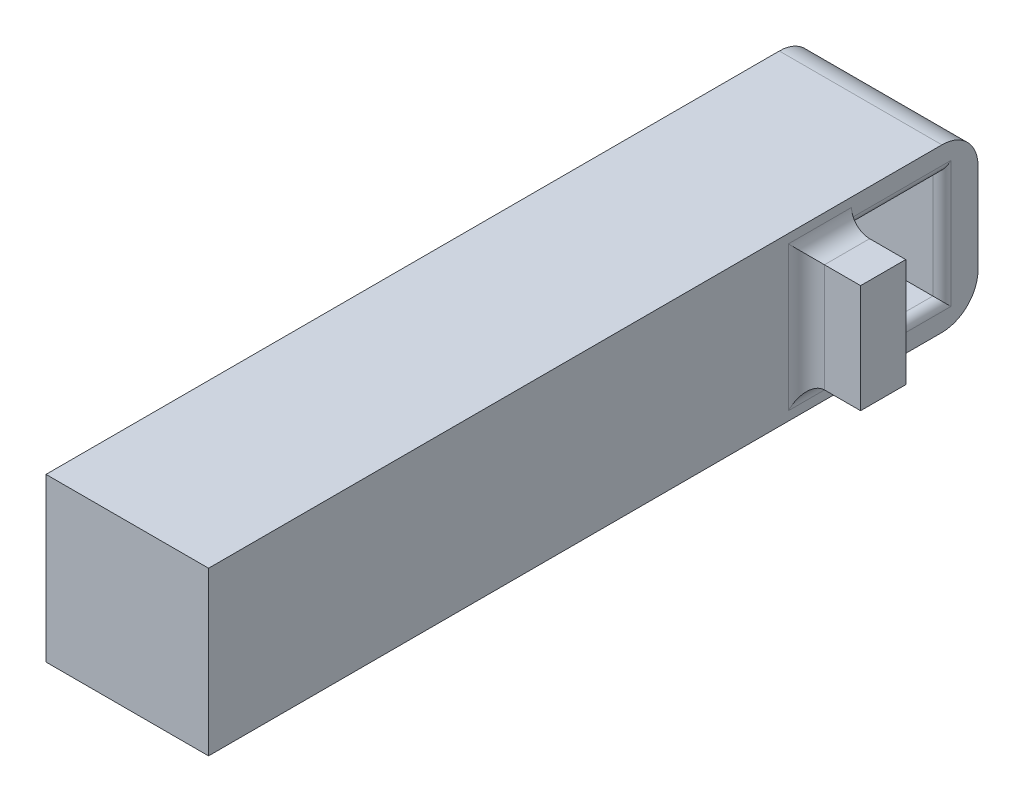
ISO-10303-21;
HEADER;
FILE_DESCRIPTION(('STEP AP214'),'2;1');
FILE_NAME('part.step','',(''),(''),'','','');
FILE_SCHEMA(('AUTOMOTIVE_DESIGN { 1 0 10303 214 1 1 1 1 }'));
ENDSEC;
DATA;
#1=APPLICATION_CONTEXT('core data for automotive mechanical design processes');
#2=APPLICATION_PROTOCOL_DEFINITION('international standard','automotive_design',2000,#1);
#3=PRODUCT_CONTEXT('',#1,'mechanical');
#4=PRODUCT('Part','Part','',(#3));
#5=PRODUCT_RELATED_PRODUCT_CATEGORY('part','',(#4));
#6=PRODUCT_DEFINITION_FORMATION('','',#4);
#7=PRODUCT_DEFINITION_CONTEXT('part definition',#1,'design');
#8=PRODUCT_DEFINITION('design','',#6,#7);
#9=PRODUCT_DEFINITION_SHAPE('','',#8);
#10=(LENGTH_UNIT() NAMED_UNIT(*) SI_UNIT(.MILLI.,.METRE.));
#11=(NAMED_UNIT(*) PLANE_ANGLE_UNIT() SI_UNIT($,.RADIAN.));
#12=(NAMED_UNIT(*) SI_UNIT($,.STERADIAN.) SOLID_ANGLE_UNIT());
#13=UNCERTAINTY_MEASURE_WITH_UNIT(LENGTH_MEASURE(1.E-05),#10,'distance_accuracy_value','');
#14=(GEOMETRIC_REPRESENTATION_CONTEXT(3) GLOBAL_UNCERTAINTY_ASSIGNED_CONTEXT((#13)) GLOBAL_UNIT_ASSIGNED_CONTEXT((#10,
#11,#12)) REPRESENTATION_CONTEXT('',''));
#15=CARTESIAN_POINT('',(0.,0.,0.));
#16=DIRECTION('',(0.,0.,1.));
#17=DIRECTION('',(1.,0.,0.));
#18=AXIS2_PLACEMENT_3D('',#15,#16,#17);
#19=CARTESIAN_POINT('',(9.,0.,0.));
#20=DIRECTION('',(-1.,0.,0.));
#21=DIRECTION('',(0.,0.,1.));
#22=AXIS2_PLACEMENT_3D('',#19,#20,#21);
#23=PLANE('',#22);
#24=DIRECTION('',(0.,0.,-1.));
#25=VECTOR('',#24,1.);
#26=CARTESIAN_POINT('',(9.,0.,0.));
#27=LINE('',#26,#25);
#28=CARTESIAN_POINT('',(9.,0.,0.));
#29=VERTEX_POINT('',#28);
#30=CARTESIAN_POINT('',(9.,0.,-81.1999999999999));
#31=VERTEX_POINT('',#30);
#32=EDGE_CURVE('E225',#29,#31,#27,.T.);
#33=ORIENTED_EDGE('',*,*,#32,.T.);
#34=CARTESIAN_POINT('',(9.,4.,-81.2));
#35=DIRECTION('',(-1.,0.,0.));
#36=DIRECTION('',(0.,0.,1.));
#37=AXIS2_PLACEMENT_3D('',#34,#35,#36);
#38=CIRCLE('',#37,4.);
#39=CARTESIAN_POINT('',(9.,4.,-85.2));
#40=VERTEX_POINT('',#39);
#41=EDGE_CURVE('E51',#31,#40,#38,.F.);
#42=ORIENTED_EDGE('',*,*,#41,.T.);
#43=DIRECTION('',(0.,1.,0.));
#44=VECTOR('',#43,1.);
#45=CARTESIAN_POINT('',(9.,0.,-85.2));
#46=LINE('',#45,#44);
#47=CARTESIAN_POINT('',(9.,14.,-85.2));
#48=VERTEX_POINT('',#47);
#49=EDGE_CURVE('E228',#40,#48,#46,.T.);
#50=ORIENTED_EDGE('',*,*,#49,.T.);
#51=CARTESIAN_POINT('',(9.,14.,-81.2));
#52=DIRECTION('',(-1.,0.,0.));
#53=DIRECTION('',(0.,0.,1.));
#54=AXIS2_PLACEMENT_3D('',#51,#52,#53);
#55=CIRCLE('',#54,4.);
#56=CARTESIAN_POINT('',(9.,18.,-81.1999999999999));
#57=VERTEX_POINT('',#56);
#58=EDGE_CURVE('E58',#48,#57,#55,.F.);
#59=ORIENTED_EDGE('',*,*,#58,.T.);
#60=DIRECTION('',(0.,0.,1.));
#61=VECTOR('',#60,1.);
#62=CARTESIAN_POINT('',(9.,18.,0.));
#63=LINE('',#62,#61);
#64=CARTESIAN_POINT('',(9.,18.,0.));
#65=VERTEX_POINT('',#64);
#66=EDGE_CURVE('E230',#57,#65,#63,.T.);
#67=ORIENTED_EDGE('',*,*,#66,.T.);
#68=DIRECTION('',(0.,-1.,0.));
#69=VECTOR('',#68,1.);
#70=CARTESIAN_POINT('',(9.,0.,0.));
#71=LINE('',#70,#69);
#72=EDGE_CURVE('E222',#65,#29,#71,.T.);
#73=ORIENTED_EDGE('',*,*,#72,.T.);
#74=EDGE_LOOP('',(#33,#42,#50,#59,#67,#73));
#75=FACE_BOUND('',#74,.T.);
#76=DIRECTION('',(0.,1.,0.));
#77=VECTOR('',#76,1.);
#78=CARTESIAN_POINT('',(9.,3.,-82.2));
#79=LINE('',#78,#77);
#80=CARTESIAN_POINT('',(9.,16.,-82.2));
#81=VERTEX_POINT('',#80);
#82=CARTESIAN_POINT('',(9.,2.,-82.2));
#83=VERTEX_POINT('',#82);
#84=EDGE_CURVE('E279',#81,#83,#79,.F.);
#85=ORIENTED_EDGE('',*,*,#84,.T.);
#86=DIRECTION('',(0.,0.,-1.));
#87=VECTOR('',#86,1.);
#88=CARTESIAN_POINT('',(9.,2.,-71.2));
#89=LINE('',#88,#87);
#90=CARTESIAN_POINT('',(9.,2.,-71.2));
#91=VERTEX_POINT('',#90);
#92=EDGE_CURVE('E281',#83,#91,#89,.F.);
#93=ORIENTED_EDGE('',*,*,#92,.T.);
#94=DIRECTION('',(0.,-1.,0.));
#95=VECTOR('',#94,1.);
#96=CARTESIAN_POINT('',(9.,0.,-71.2));
#97=LINE('',#96,#95);
#98=CARTESIAN_POINT('',(9.,1.,-71.2));
#99=VERTEX_POINT('',#98);
#100=EDGE_CURVE('E251',#91,#99,#97,.T.);
#101=ORIENTED_EDGE('',*,*,#100,.T.);
#102=DIRECTION('',(0.,0.,-1.));
#103=VECTOR('',#102,1.);
#104=CARTESIAN_POINT('',(9.,1.,-66.2));
#105=LINE('',#104,#103);
#106=CARTESIAN_POINT('',(9.,0.999999999999999,-64.2));
#107=VERTEX_POINT('',#106);
#108=EDGE_CURVE('E249',#99,#107,#105,.F.);
#109=ORIENTED_EDGE('',*,*,#108,.T.);
#110=DIRECTION('',(0.,-1.,0.));
#111=VECTOR('',#110,1.);
#112=CARTESIAN_POINT('',(9.,15.,-64.2));
#113=LINE('',#112,#111);
#114=CARTESIAN_POINT('',(9.,17.,-64.2));
#115=VERTEX_POINT('',#114);
#116=EDGE_CURVE('E253',#107,#115,#113,.F.);
#117=ORIENTED_EDGE('',*,*,#116,.T.);
#118=DIRECTION('',(0.,0.,1.));
#119=VECTOR('',#118,1.);
#120=CARTESIAN_POINT('',(9.,17.,-71.2));
#121=LINE('',#120,#119);
#122=CARTESIAN_POINT('',(9.,17.,-71.2));
#123=VERTEX_POINT('',#122);
#124=EDGE_CURVE('E255',#115,#123,#121,.F.);
#125=ORIENTED_EDGE('',*,*,#124,.T.);
#126=DIRECTION('',(0.,-1.,0.));
#127=VECTOR('',#126,1.);
#128=CARTESIAN_POINT('',(9.,0.,-71.2));
#129=LINE('',#128,#127);
#130=CARTESIAN_POINT('',(9.,16.,-71.2));
#131=VERTEX_POINT('',#130);
#132=EDGE_CURVE('E258',#123,#131,#129,.T.);
#133=ORIENTED_EDGE('',*,*,#132,.T.);
#134=DIRECTION('',(0.,0.,1.));
#135=VECTOR('',#134,1.);
#136=CARTESIAN_POINT('',(9.,16.,-81.2));
#137=LINE('',#136,#135);
#138=EDGE_CURVE('E277',#131,#81,#137,.F.);
#139=ORIENTED_EDGE('',*,*,#138,.T.);
#140=EDGE_LOOP('',(#85,#93,#101,#109,#117,#125,#133,#139));
#141=FACE_BOUND('',#140,.T.);
#142=ADVANCED_FACE('F43',(#75,#141),#23,.F.);
#143=CARTESIAN_POINT('',(-9.,0.,0.));
#144=DIRECTION('',(-1.,0.,0.));
#145=DIRECTION('',(0.,0.,1.));
#146=AXIS2_PLACEMENT_3D('',#143,#144,#145);
#147=PLANE('',#146);
#148=DIRECTION('',(0.,1.,0.));
#149=VECTOR('',#148,1.);
#150=CARTESIAN_POINT('',(-9.,0.,-85.2));
#151=LINE('',#150,#149);
#152=CARTESIAN_POINT('',(-9.,4.,-85.2));
#153=VERTEX_POINT('',#152);
#154=CARTESIAN_POINT('',(-9.,14.,-85.2));
#155=VERTEX_POINT('',#154);
#156=EDGE_CURVE('E237',#153,#155,#151,.T.);
#157=ORIENTED_EDGE('',*,*,#156,.F.);
#158=CARTESIAN_POINT('',(-9.,4.,-81.2));
#159=DIRECTION('',(-1.,0.,0.));
#160=DIRECTION('',(0.,0.,1.));
#161=AXIS2_PLACEMENT_3D('',#158,#159,#160);
#162=CIRCLE('',#161,4.);
#163=CARTESIAN_POINT('',(-9.,0.,-81.1999999999999));
#164=VERTEX_POINT('',#163);
#165=EDGE_CURVE('E302',#153,#164,#162,.T.);
#166=ORIENTED_EDGE('',*,*,#165,.T.);
#167=DIRECTION('',(0.,0.,-1.));
#168=VECTOR('',#167,1.);
#169=CARTESIAN_POINT('',(-9.,0.,0.));
#170=LINE('',#169,#168);
#171=CARTESIAN_POINT('',(-9.,0.,0.));
#172=VERTEX_POINT('',#171);
#173=EDGE_CURVE('E235',#172,#164,#170,.T.);
#174=ORIENTED_EDGE('',*,*,#173,.F.);
#175=DIRECTION('',(0.,-1.,0.));
#176=VECTOR('',#175,1.);
#177=CARTESIAN_POINT('',(-9.,0.,0.));
#178=LINE('',#177,#176);
#179=CARTESIAN_POINT('',(-9.,18.,0.));
#180=VERTEX_POINT('',#179);
#181=EDGE_CURVE('E221',#180,#172,#178,.T.);
#182=ORIENTED_EDGE('',*,*,#181,.F.);
#183=DIRECTION('',(0.,0.,1.));
#184=VECTOR('',#183,1.);
#185=CARTESIAN_POINT('',(-9.,18.,0.));
#186=LINE('',#185,#184);
#187=CARTESIAN_POINT('',(-9.,18.,-81.1999999999999));
#188=VERTEX_POINT('',#187);
#189=EDGE_CURVE('E226',#188,#180,#186,.T.);
#190=ORIENTED_EDGE('',*,*,#189,.F.);
#191=CARTESIAN_POINT('',(-9.,14.,-81.2));
#192=DIRECTION('',(-1.,0.,0.));
#193=DIRECTION('',(0.,0.,1.));
#194=AXIS2_PLACEMENT_3D('',#191,#192,#193);
#195=CIRCLE('',#194,4.);
#196=EDGE_CURVE('E300',#188,#155,#195,.T.);
#197=ORIENTED_EDGE('',*,*,#196,.T.);
#198=EDGE_LOOP('',(#157,#166,#174,#182,#190,#197));
#199=FACE_BOUND('',#198,.T.);
#200=DIRECTION('',(0.,0.,-1.));
#201=VECTOR('',#200,1.);
#202=CARTESIAN_POINT('',(-9.,3.,-81.2));
#203=LINE('',#202,#201);
#204=CARTESIAN_POINT('',(-9.,3.,-71.2));
#205=VERTEX_POINT('',#204);
#206=CARTESIAN_POINT('',(-9.,3.,-81.2));
#207=VERTEX_POINT('',#206);
#208=EDGE_CURVE('E210',#205,#207,#203,.T.);
#209=ORIENTED_EDGE('',*,*,#208,.T.);
#210=DIRECTION('',(0.,1.,0.));
#211=VECTOR('',#210,1.);
#212=CARTESIAN_POINT('',(-9.,3.,-81.2));
#213=LINE('',#212,#211);
#214=CARTESIAN_POINT('',(-9.,15.,-81.2));
#215=VERTEX_POINT('',#214);
#216=EDGE_CURVE('E196',#207,#215,#213,.T.);
#217=ORIENTED_EDGE('',*,*,#216,.T.);
#218=DIRECTION('',(0.,0.,1.));
#219=VECTOR('',#218,1.);
#220=CARTESIAN_POINT('',(-9.,15.,-81.2));
#221=LINE('',#220,#219);
#222=CARTESIAN_POINT('',(-9.,15.,-71.2));
#223=VERTEX_POINT('',#222);
#224=EDGE_CURVE('E199',#215,#223,#221,.T.);
#225=ORIENTED_EDGE('',*,*,#224,.T.);
#226=DIRECTION('',(0.,-1.,0.));
#227=VECTOR('',#226,1.);
#228=CARTESIAN_POINT('',(-9.,3.,-71.2));
#229=LINE('',#228,#227);
#230=EDGE_CURVE('E207',#223,#205,#229,.T.);
#231=ORIENTED_EDGE('',*,*,#230,.T.);
#232=EDGE_LOOP('',(#209,#217,#225,#231));
#233=FACE_BOUND('',#232,.T.);
#234=ADVANCED_FACE('F316',(#199,#233),#147,.T.);
#235=CARTESIAN_POINT('',(9.,0.,0.));
#236=DIRECTION('',(0.,0.,-1.));
#237=DIRECTION('',(-1.,0.,0.));
#238=AXIS2_PLACEMENT_3D('',#235,#236,#237);
#239=PLANE('',#238);
#240=ORIENTED_EDGE('',*,*,#181,.T.);
#241=DIRECTION('',(-1.,0.,0.));
#242=VECTOR('',#241,1.);
#243=CARTESIAN_POINT('',(9.,0.,0.));
#244=LINE('',#243,#242);
#245=EDGE_CURVE('E243',#29,#172,#244,.T.);
#246=ORIENTED_EDGE('',*,*,#245,.F.);
#247=ORIENTED_EDGE('',*,*,#72,.F.);
#248=DIRECTION('',(-1.,0.,0.));
#249=VECTOR('',#248,1.);
#250=CARTESIAN_POINT('',(9.,18.,0.));
#251=LINE('',#250,#249);
#252=EDGE_CURVE('E232',#65,#180,#251,.T.);
#253=ORIENTED_EDGE('',*,*,#252,.T.);
#254=EDGE_LOOP('',(#240,#246,#247,#253));
#255=FACE_BOUND('',#254,.T.);
#256=ADVANCED_FACE('F323',(#255),#239,.F.);
#257=CARTESIAN_POINT('',(9.,0.,0.));
#258=DIRECTION('',(0.,1.,0.));
#259=DIRECTION('',(0.,0.,1.));
#260=AXIS2_PLACEMENT_3D('',#257,#258,#259);
#261=PLANE('',#260);
#262=ORIENTED_EDGE('',*,*,#173,.T.);
#263=DIRECTION('',(-1.,0.,0.));
#264=VECTOR('',#263,1.);
#265=CARTESIAN_POINT('',(9.,0.,-81.2));
#266=LINE('',#265,#264);
#267=EDGE_CURVE('E66',#164,#31,#266,.F.);
#268=ORIENTED_EDGE('',*,*,#267,.T.);
#269=ORIENTED_EDGE('',*,*,#32,.F.);
#270=ORIENTED_EDGE('',*,*,#245,.T.);
#271=EDGE_LOOP('',(#262,#268,#269,#270));
#272=FACE_BOUND('',#271,.T.);
#273=ADVANCED_FACE('F319',(#272),#261,.F.);
#274=CARTESIAN_POINT('',(9.,0.,-85.2));
#275=DIRECTION('',(0.,0.,1.));
#276=DIRECTION('',(1.,0.,0.));
#277=AXIS2_PLACEMENT_3D('',#274,#275,#276);
#278=PLANE('',#277);
#279=ORIENTED_EDGE('',*,*,#49,.F.);
#280=DIRECTION('',(-1.,0.,0.));
#281=VECTOR('',#280,1.);
#282=CARTESIAN_POINT('',(9.,4.,-85.2));
#283=LINE('',#282,#281);
#284=EDGE_CURVE('E297',#40,#153,#283,.T.);
#285=ORIENTED_EDGE('',*,*,#284,.T.);
#286=ORIENTED_EDGE('',*,*,#156,.T.);
#287=DIRECTION('',(-1.,0.,0.));
#288=VECTOR('',#287,1.);
#289=CARTESIAN_POINT('',(9.,14.,-85.2));
#290=LINE('',#289,#288);
#291=EDGE_CURVE('E291',#155,#48,#290,.F.);
#292=ORIENTED_EDGE('',*,*,#291,.T.);
#293=EDGE_LOOP('',(#279,#285,#286,#292));
#294=FACE_BOUND('',#293,.T.);
#295=ADVANCED_FACE('F311',(#294),#278,.F.);
#296=CARTESIAN_POINT('',(9.,18.,0.));
#297=DIRECTION('',(0.,-1.,0.));
#298=DIRECTION('',(0.,0.,-1.));
#299=AXIS2_PLACEMENT_3D('',#296,#297,#298);
#300=PLANE('',#299);
#301=ORIENTED_EDGE('',*,*,#66,.F.);
#302=DIRECTION('',(-1.,0.,0.));
#303=VECTOR('',#302,1.);
#304=CARTESIAN_POINT('',(9.,18.,-81.2));
#305=LINE('',#304,#303);
#306=EDGE_CURVE('E11',#57,#188,#305,.T.);
#307=ORIENTED_EDGE('',*,*,#306,.T.);
#308=ORIENTED_EDGE('',*,*,#189,.T.);
#309=ORIENTED_EDGE('',*,*,#252,.F.);
#310=EDGE_LOOP('',(#301,#307,#308,#309));
#311=FACE_BOUND('',#310,.T.);
#312=ADVANCED_FACE('F327',(#311),#300,.F.);
#313=CARTESIAN_POINT('',(9.,3.,-81.2));
#314=DIRECTION('',(0.,0.,1.));
#315=DIRECTION('',(1.,0.,0.));
#316=AXIS2_PLACEMENT_3D('',#313,#314,#315);
#317=PLANE('',#316);
#318=DIRECTION('',(-1.,0.,0.));
#319=VECTOR('',#318,1.);
#320=CARTESIAN_POINT('',(9.,3.,-81.2));
#321=LINE('',#320,#319);
#322=CARTESIAN_POINT('',(8.,3.,-81.2));
#323=VERTEX_POINT('',#322);
#324=EDGE_CURVE('E213',#323,#207,#321,.T.);
#325=ORIENTED_EDGE('',*,*,#324,.F.);
#326=DIRECTION('',(0.,1.,0.));
#327=VECTOR('',#326,1.);
#328=CARTESIAN_POINT('',(8.,15.,-81.2));
#329=LINE('',#328,#327);
#330=CARTESIAN_POINT('',(8.,15.,-81.2));
#331=VERTEX_POINT('',#330);
#332=EDGE_CURVE('E283',#323,#331,#329,.T.);
#333=ORIENTED_EDGE('',*,*,#332,.T.);
#334=DIRECTION('',(-1.,0.,0.));
#335=VECTOR('',#334,1.);
#336=CARTESIAN_POINT('',(9.,15.,-81.2));
#337=LINE('',#336,#335);
#338=EDGE_CURVE('E219',#331,#215,#337,.T.);
#339=ORIENTED_EDGE('',*,*,#338,.T.);
#340=ORIENTED_EDGE('',*,*,#216,.F.);
#341=EDGE_LOOP('',(#325,#333,#339,#340));
#342=FACE_BOUND('',#341,.T.);
#343=ADVANCED_FACE('F343',(#342),#317,.T.);
#344=CARTESIAN_POINT('',(9.,15.,-81.2));
#345=DIRECTION('',(0.,-1.,0.));
#346=DIRECTION('',(0.,0.,-1.));
#347=AXIS2_PLACEMENT_3D('',#344,#345,#346);
#348=PLANE('',#347);
#349=ORIENTED_EDGE('',*,*,#338,.F.);
#350=DIRECTION('',(0.,0.,1.));
#351=VECTOR('',#350,1.);
#352=CARTESIAN_POINT('',(8.,15.,-71.2));
#353=LINE('',#352,#351);
#354=CARTESIAN_POINT('',(8.,15.,-71.2));
#355=VERTEX_POINT('',#354);
#356=EDGE_CURVE('E285',#331,#355,#353,.T.);
#357=ORIENTED_EDGE('',*,*,#356,.T.);
#358=DIRECTION('',(-1.,0.,0.));
#359=VECTOR('',#358,1.);
#360=CARTESIAN_POINT('',(9.,15.,-71.2));
#361=LINE('',#360,#359);
#362=EDGE_CURVE('E217',#355,#223,#361,.T.);
#363=ORIENTED_EDGE('',*,*,#362,.T.);
#364=ORIENTED_EDGE('',*,*,#224,.F.);
#365=EDGE_LOOP('',(#349,#357,#363,#364));
#366=FACE_BOUND('',#365,.T.);
#367=ADVANCED_FACE('F417',(#366),#348,.T.);
#368=CARTESIAN_POINT('',(9.,3.,-71.2));
#369=DIRECTION('',(0.,0.,-1.));
#370=DIRECTION('',(-1.,0.,0.));
#371=AXIS2_PLACEMENT_3D('',#368,#369,#370);
#372=PLANE('',#371);
#373=ORIENTED_EDGE('',*,*,#230,.F.);
#374=ORIENTED_EDGE('',*,*,#362,.F.);
#375=CARTESIAN_POINT('',(8.,16.,-71.2));
#376=DIRECTION('',(0.,0.,-1.));
#377=DIRECTION('',(-1.,0.,0.));
#378=AXIS2_PLACEMENT_3D('',#375,#376,#377);
#379=CIRCLE('',#378,1.);
#380=EDGE_CURVE('E289',#355,#131,#379,.F.);
#381=ORIENTED_EDGE('',*,*,#380,.T.);
#382=ORIENTED_EDGE('',*,*,#132,.F.);
#383=CARTESIAN_POINT('',(11.,17.,-71.2));
#384=DIRECTION('',(0.,0.,-1.));
#385=DIRECTION('',(-1.,0.,0.));
#386=AXIS2_PLACEMENT_3D('',#383,#384,#385);
#387=CIRCLE('',#386,2.);
#388=CARTESIAN_POINT('',(11.,15.,-71.2));
#389=VERTEX_POINT('',#388);
#390=EDGE_CURVE('E195',#123,#389,#387,.F.);
#391=ORIENTED_EDGE('',*,*,#390,.T.);
#392=DIRECTION('',(-1.,0.,0.));
#393=VECTOR('',#392,1.);
#394=CARTESIAN_POINT('',(15.,15.,-71.2));
#395=LINE('',#394,#393);
#396=CARTESIAN_POINT('',(15.,15.,-71.2));
#397=VERTEX_POINT('',#396);
#398=EDGE_CURVE('E174',#397,#389,#395,.T.);
#399=ORIENTED_EDGE('',*,*,#398,.F.);
#400=DIRECTION('',(0.,1.,0.));
#401=VECTOR('',#400,1.);
#402=CARTESIAN_POINT('',(15.,3.,-71.2));
#403=LINE('',#402,#401);
#404=CARTESIAN_POINT('',(15.,3.,-71.2));
#405=VERTEX_POINT('',#404);
#406=EDGE_CURVE('E181',#405,#397,#403,.T.);
#407=ORIENTED_EDGE('',*,*,#406,.F.);
#408=DIRECTION('',(-1.,0.,0.));
#409=VECTOR('',#408,1.);
#410=CARTESIAN_POINT('',(15.,3.,-71.2));
#411=LINE('',#410,#409);
#412=CARTESIAN_POINT('',(11.,3.,-71.2));
#413=VERTEX_POINT('',#412);
#414=EDGE_CURVE('E392',#405,#413,#411,.T.);
#415=ORIENTED_EDGE('',*,*,#414,.T.);
#416=CARTESIAN_POINT('',(11.,1.,-71.2));
#417=DIRECTION('',(0.,0.,-1.));
#418=DIRECTION('',(-1.,0.,0.));
#419=AXIS2_PLACEMENT_3D('',#416,#417,#418);
#420=CIRCLE('',#419,2.);
#421=EDGE_CURVE('E266',#413,#99,#420,.F.);
#422=ORIENTED_EDGE('',*,*,#421,.T.);
#423=ORIENTED_EDGE('',*,*,#100,.F.);
#424=CARTESIAN_POINT('',(8.,2.,-71.2));
#425=DIRECTION('',(0.,0.,-1.));
#426=DIRECTION('',(-1.,0.,0.));
#427=AXIS2_PLACEMENT_3D('',#424,#425,#426);
#428=CIRCLE('',#427,1.);
#429=CARTESIAN_POINT('',(8.,3.,-71.2));
#430=VERTEX_POINT('',#429);
#431=EDGE_CURVE('E287',#91,#430,#428,.F.);
#432=ORIENTED_EDGE('',*,*,#431,.T.);
#433=DIRECTION('',(-1.,0.,0.));
#434=VECTOR('',#433,1.);
#435=CARTESIAN_POINT('',(9.,3.,-71.2));
#436=LINE('',#435,#434);
#437=EDGE_CURVE('E215',#430,#205,#436,.T.);
#438=ORIENTED_EDGE('',*,*,#437,.T.);
#439=EDGE_LOOP('',(#373,#374,#381,#382,#391,#399,#407,#415,#422,#423,#432,#438));
#440=FACE_BOUND('',#439,.T.);
#441=ADVANCED_FACE('F193',(#440),#372,.T.);
#442=CARTESIAN_POINT('',(9.,3.,-81.2));
#443=DIRECTION('',(0.,1.,0.));
#444=DIRECTION('',(0.,0.,1.));
#445=AXIS2_PLACEMENT_3D('',#442,#443,#444);
#446=PLANE('',#445);
#447=ORIENTED_EDGE('',*,*,#437,.F.);
#448=DIRECTION('',(0.,0.,-1.));
#449=VECTOR('',#448,1.);
#450=CARTESIAN_POINT('',(8.,3.,-81.2));
#451=LINE('',#450,#449);
#452=EDGE_CURVE('E269',#430,#323,#451,.T.);
#453=ORIENTED_EDGE('',*,*,#452,.T.);
#454=ORIENTED_EDGE('',*,*,#324,.T.);
#455=ORIENTED_EDGE('',*,*,#208,.F.);
#456=EDGE_LOOP('',(#447,#453,#454,#455));
#457=FACE_BOUND('',#456,.T.);
#458=ADVANCED_FACE('F410',(#457),#446,.T.);
#459=CARTESIAN_POINT('',(15.,15.,-71.2));
#460=DIRECTION('',(0.,-1.,0.));
#461=DIRECTION('',(0.,0.,-1.));
#462=AXIS2_PLACEMENT_3D('',#459,#460,#461);
#463=PLANE('',#462);
#464=ORIENTED_EDGE('',*,*,#398,.T.);
#465=DIRECTION('',(0.,0.,1.));
#466=VECTOR('',#465,1.);
#467=CARTESIAN_POINT('',(11.,15.,-66.2));
#468=LINE('',#467,#466);
#469=CARTESIAN_POINT('',(11.,15.,-66.2));
#470=VERTEX_POINT('',#469);
#471=EDGE_CURVE('E261',#389,#470,#468,.T.);
#472=ORIENTED_EDGE('',*,*,#471,.T.);
#473=DIRECTION('',(-1.,0.,0.));
#474=VECTOR('',#473,1.);
#475=CARTESIAN_POINT('',(15.,15.,-66.2));
#476=LINE('',#475,#474);
#477=CARTESIAN_POINT('',(15.,15.,-66.2));
#478=VERTEX_POINT('',#477);
#479=EDGE_CURVE('E177',#478,#470,#476,.T.);
#480=ORIENTED_EDGE('',*,*,#479,.F.);
#481=DIRECTION('',(0.,0.,1.));
#482=VECTOR('',#481,1.);
#483=CARTESIAN_POINT('',(15.,15.,-71.2));
#484=LINE('',#483,#482);
#485=EDGE_CURVE('E170',#397,#478,#484,.T.);
#486=ORIENTED_EDGE('',*,*,#485,.F.);
#487=EDGE_LOOP('',(#464,#472,#480,#486));
#488=FACE_BOUND('',#487,.T.);
#489=ADVANCED_FACE('F172',(#488),#463,.F.);
#490=CARTESIAN_POINT('',(15.,3.,-66.2));
#491=DIRECTION('',(0.,0.,-1.));
#492=DIRECTION('',(-1.,0.,0.));
#493=AXIS2_PLACEMENT_3D('',#490,#491,#492);
#494=PLANE('',#493);
#495=ORIENTED_EDGE('',*,*,#479,.T.);
#496=DIRECTION('',(0.,-1.,0.));
#497=VECTOR('',#496,1.);
#498=CARTESIAN_POINT('',(11.,3.,-66.2));
#499=LINE('',#498,#497);
#500=CARTESIAN_POINT('',(11.,3.,-66.2));
#501=VERTEX_POINT('',#500);
#502=EDGE_CURVE('E246',#470,#501,#499,.T.);
#503=ORIENTED_EDGE('',*,*,#502,.T.);
#504=DIRECTION('',(-1.,0.,0.));
#505=VECTOR('',#504,1.);
#506=CARTESIAN_POINT('',(15.,3.,-66.2));
#507=LINE('',#506,#505);
#508=CARTESIAN_POINT('',(15.,3.,-66.2));
#509=VERTEX_POINT('',#508);
#510=EDGE_CURVE('E201',#509,#501,#507,.T.);
#511=ORIENTED_EDGE('',*,*,#510,.F.);
#512=DIRECTION('',(0.,-1.,0.));
#513=VECTOR('',#512,1.);
#514=CARTESIAN_POINT('',(15.,3.,-66.2));
#515=LINE('',#514,#513);
#516=EDGE_CURVE('E180',#478,#509,#515,.T.);
#517=ORIENTED_EDGE('',*,*,#516,.F.);
#518=EDGE_LOOP('',(#495,#503,#511,#517));
#519=FACE_BOUND('',#518,.T.);
#520=ADVANCED_FACE('F388',(#519),#494,.F.);
#521=CARTESIAN_POINT('',(15.,3.,-71.2));
#522=DIRECTION('',(0.,1.,0.));
#523=DIRECTION('',(0.,0.,1.));
#524=AXIS2_PLACEMENT_3D('',#521,#522,#523);
#525=PLANE('',#524);
#526=ORIENTED_EDGE('',*,*,#510,.T.);
#527=DIRECTION('',(0.,0.,-1.));
#528=VECTOR('',#527,1.);
#529=CARTESIAN_POINT('',(11.,3.,-71.2));
#530=LINE('',#529,#528);
#531=EDGE_CURVE('E263',#501,#413,#530,.T.);
#532=ORIENTED_EDGE('',*,*,#531,.T.);
#533=ORIENTED_EDGE('',*,*,#414,.F.);
#534=DIRECTION('',(0.,0.,-1.));
#535=VECTOR('',#534,1.);
#536=CARTESIAN_POINT('',(15.,3.,-71.2));
#537=LINE('',#536,#535);
#538=EDGE_CURVE('E186',#509,#405,#537,.T.);
#539=ORIENTED_EDGE('',*,*,#538,.F.);
#540=EDGE_LOOP('',(#526,#532,#533,#539));
#541=FACE_BOUND('',#540,.T.);
#542=ADVANCED_FACE('F396',(#541),#525,.F.);
#543=CARTESIAN_POINT('',(15.,0.,0.));
#544=DIRECTION('',(1.,0.,0.));
#545=DIRECTION('',(0.,0.,-1.));
#546=AXIS2_PLACEMENT_3D('',#543,#544,#545);
#547=PLANE('',#546);
#548=ORIENTED_EDGE('',*,*,#406,.T.);
#549=ORIENTED_EDGE('',*,*,#485,.T.);
#550=ORIENTED_EDGE('',*,*,#516,.T.);
#551=ORIENTED_EDGE('',*,*,#538,.T.);
#552=EDGE_LOOP('',(#548,#549,#550,#551));
#553=FACE_BOUND('',#552,.T.);
#554=ADVANCED_FACE('F184',(#553),#547,.T.);
#555=CARTESIAN_POINT('',(11.,17.,-71.2));
#556=DIRECTION('',(0.,0.,-1.));
#557=DIRECTION('',(-1.,0.,0.));
#558=AXIS2_PLACEMENT_3D('',#555,#556,#557);
#559=CYLINDRICAL_SURFACE('',#558,2.);
#560=ORIENTED_EDGE('',*,*,#390,.F.);
#561=ORIENTED_EDGE('',*,*,#124,.F.);
#562=CARTESIAN_POINT('',(11.,17.,-64.2));
#563=DIRECTION('',(0.,0.707106781186547,-0.707106781186547));
#564=DIRECTION('',(0.,-0.707106781186547,-0.707106781186547));
#565=AXIS2_PLACEMENT_3D('',#562,#563,#564);
#566=ELLIPSE('',#565,2.82842712474619,2.);
#567=EDGE_CURVE('E190',#470,#115,#566,.T.);
#568=ORIENTED_EDGE('',*,*,#567,.F.);
#569=ORIENTED_EDGE('',*,*,#471,.F.);
#570=EDGE_LOOP('',(#560,#561,#568,#569));
#571=FACE_BOUND('',#570,.T.);
#572=ADVANCED_FACE('F362',(#571),#559,.F.);
#573=CARTESIAN_POINT('',(11.,1.,-71.2));
#574=DIRECTION('',(0.,0.,1.));
#575=DIRECTION('',(0.,-1.,0.));
#576=AXIS2_PLACEMENT_3D('',#573,#574,#575);
#577=CYLINDRICAL_SURFACE('',#576,2.);
#578=ORIENTED_EDGE('',*,*,#421,.F.);
#579=ORIENTED_EDGE('',*,*,#531,.F.);
#580=CARTESIAN_POINT('',(11.,1.,-64.2));
#581=DIRECTION('',(0.,0.707106781186547,0.707106781186548));
#582=DIRECTION('',(0.,-0.707106781186547,0.707106781186547));
#583=AXIS2_PLACEMENT_3D('',#580,#581,#582);
#584=ELLIPSE('',#583,2.82842712474619,2.);
#585=EDGE_CURVE('E270',#107,#501,#584,.F.);
#586=ORIENTED_EDGE('',*,*,#585,.F.);
#587=ORIENTED_EDGE('',*,*,#108,.F.);
#588=EDGE_LOOP('',(#578,#579,#586,#587));
#589=FACE_BOUND('',#588,.T.);
#590=ADVANCED_FACE('F358',(#589),#577,.F.);
#591=CARTESIAN_POINT('',(11.,3.,-64.2));
#592=DIRECTION('',(0.,1.,0.));
#593=DIRECTION('',(0.,0.,1.));
#594=AXIS2_PLACEMENT_3D('',#591,#592,#593);
#595=CYLINDRICAL_SURFACE('',#594,2.);
#596=ORIENTED_EDGE('',*,*,#567,.T.);
#597=ORIENTED_EDGE('',*,*,#116,.F.);
#598=ORIENTED_EDGE('',*,*,#585,.T.);
#599=ORIENTED_EDGE('',*,*,#502,.F.);
#600=EDGE_LOOP('',(#596,#597,#598,#599));
#601=FACE_BOUND('',#600,.T.);
#602=ADVANCED_FACE('F354',(#601),#595,.F.);
#603=CARTESIAN_POINT('',(8.,16.,-81.2));
#604=DIRECTION('',(0.,0.,-1.));
#605=DIRECTION('',(-1.,0.,0.));
#606=AXIS2_PLACEMENT_3D('',#603,#604,#605);
#607=CYLINDRICAL_SURFACE('',#606,1.);
#608=ORIENTED_EDGE('',*,*,#380,.F.);
#609=ORIENTED_EDGE('',*,*,#356,.F.);
#610=CARTESIAN_POINT('',(8.,16.,-82.2));
#611=DIRECTION('',(0.,-0.707106781186547,-0.707106781186547));
#612=DIRECTION('',(0.,-0.707106781186547,0.707106781186547));
#613=AXIS2_PLACEMENT_3D('',#610,#611,#612);
#614=ELLIPSE('',#613,1.41421356237309,1.);
#615=EDGE_CURVE('E272',#81,#331,#614,.T.);
#616=ORIENTED_EDGE('',*,*,#615,.F.);
#617=ORIENTED_EDGE('',*,*,#138,.F.);
#618=EDGE_LOOP('',(#608,#609,#616,#617));
#619=FACE_BOUND('',#618,.T.);
#620=ADVANCED_FACE('F357',(#619),#607,.T.);
#621=CARTESIAN_POINT('',(8.,3.,-82.2));
#622=DIRECTION('',(0.,-1.,0.));
#623=DIRECTION('',(0.,0.,-1.));
#624=AXIS2_PLACEMENT_3D('',#621,#622,#623);
#625=CYLINDRICAL_SURFACE('',#624,1.);
#626=ORIENTED_EDGE('',*,*,#615,.T.);
#627=ORIENTED_EDGE('',*,*,#332,.F.);
#628=CARTESIAN_POINT('',(8.,2.,-82.2));
#629=DIRECTION('',(0.,-0.707106781186547,0.707106781186547));
#630=DIRECTION('',(0.,0.707106781186547,0.707106781186547));
#631=AXIS2_PLACEMENT_3D('',#628,#629,#630);
#632=ELLIPSE('',#631,1.41421356237309,1.);
#633=EDGE_CURVE('E292',#83,#323,#632,.T.);
#634=ORIENTED_EDGE('',*,*,#633,.F.);
#635=ORIENTED_EDGE('',*,*,#84,.F.);
#636=EDGE_LOOP('',(#626,#627,#634,#635));
#637=FACE_BOUND('',#636,.T.);
#638=ADVANCED_FACE('F368',(#637),#625,.T.);
#639=CARTESIAN_POINT('',(8.,2.,-81.2));
#640=DIRECTION('',(0.,0.,1.));
#641=DIRECTION('',(1.,0.,0.));
#642=AXIS2_PLACEMENT_3D('',#639,#640,#641);
#643=CYLINDRICAL_SURFACE('',#642,1.);
#644=ORIENTED_EDGE('',*,*,#431,.F.);
#645=ORIENTED_EDGE('',*,*,#92,.F.);
#646=ORIENTED_EDGE('',*,*,#633,.T.);
#647=ORIENTED_EDGE('',*,*,#452,.F.);
#648=EDGE_LOOP('',(#644,#645,#646,#647));
#649=FACE_BOUND('',#648,.T.);
#650=ADVANCED_FACE('F334',(#649),#643,.T.);
#651=CARTESIAN_POINT('',(9.,4.,-81.2));
#652=DIRECTION('',(-1.,0.,0.));
#653=DIRECTION('',(0.,0.,1.));
#654=AXIS2_PLACEMENT_3D('',#651,#652,#653);
#655=CYLINDRICAL_SURFACE('',#654,4.);
#656=ORIENTED_EDGE('',*,*,#41,.F.);
#657=ORIENTED_EDGE('',*,*,#267,.F.);
#658=ORIENTED_EDGE('',*,*,#165,.F.);
#659=ORIENTED_EDGE('',*,*,#284,.F.);
#660=EDGE_LOOP('',(#656,#657,#658,#659));
#661=FACE_BOUND('',#660,.T.);
#662=ADVANCED_FACE('F314',(#661),#655,.T.);
#663=CARTESIAN_POINT('',(9.,14.,-81.2));
#664=DIRECTION('',(-1.,0.,0.));
#665=DIRECTION('',(0.,0.,1.));
#666=AXIS2_PLACEMENT_3D('',#663,#664,#665);
#667=CYLINDRICAL_SURFACE('',#666,4.);
#668=ORIENTED_EDGE('',*,*,#58,.F.);
#669=ORIENTED_EDGE('',*,*,#291,.F.);
#670=ORIENTED_EDGE('',*,*,#196,.F.);
#671=ORIENTED_EDGE('',*,*,#306,.F.);
#672=EDGE_LOOP('',(#668,#669,#670,#671));
#673=FACE_BOUND('',#672,.T.);
#674=ADVANCED_FACE('F45',(#673),#667,.T.);
#675=CLOSED_SHELL('',(#142,#234,#256,#273,#295,#312,#343,#367,#441,#458,#489,#520,#542,#554,
#572,#590,#602,#620,#638,#650,#662,#674));
#676=MANIFOLD_SOLID_BREP('B2',#675);
#677=ADVANCED_BREP_SHAPE_REPRESENTATION('',(#18,#676),#14);
#678=SHAPE_DEFINITION_REPRESENTATION(#9,#677);
ENDSEC;
END-ISO-10303-21;
